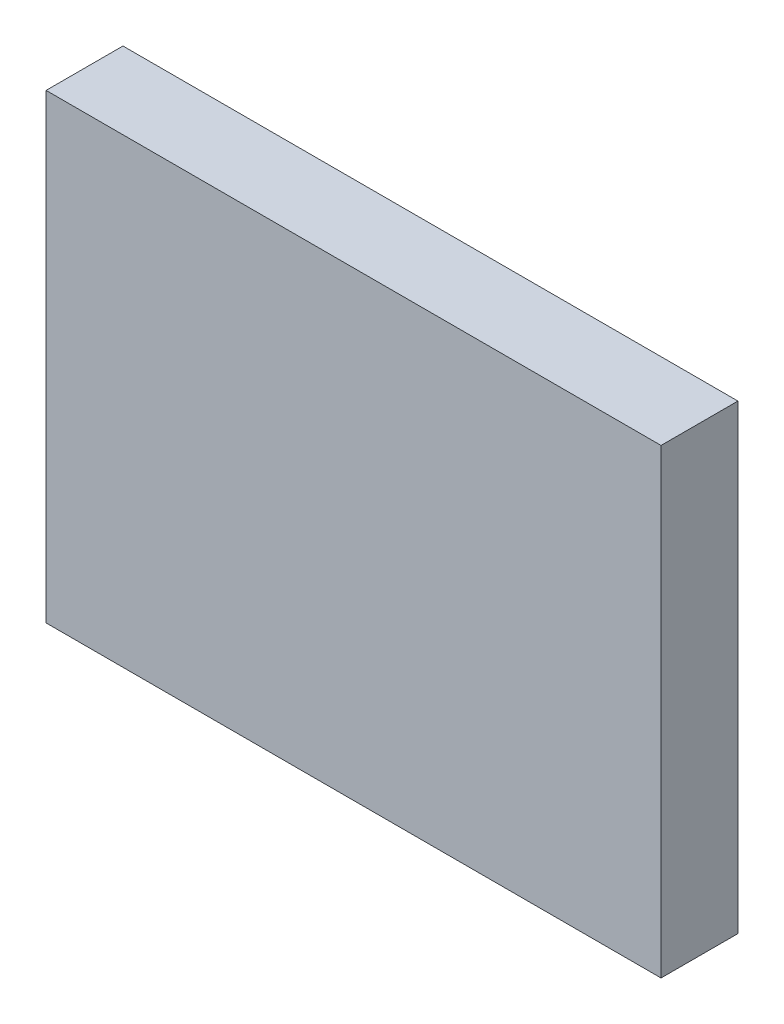
ISO-10303-21;
HEADER;
FILE_DESCRIPTION(('STEP AP214'),'2;1');
FILE_NAME('part.step','',(''),(''),'','','');
FILE_SCHEMA(('AUTOMOTIVE_DESIGN { 1 0 10303 214 1 1 1 1 }'));
ENDSEC;
DATA;
#1=APPLICATION_CONTEXT('core data for automotive mechanical design processes');
#2=APPLICATION_PROTOCOL_DEFINITION('international standard','automotive_design',2000,#1);
#3=PRODUCT_CONTEXT('',#1,'mechanical');
#4=PRODUCT('Part','Part','',(#3));
#5=PRODUCT_RELATED_PRODUCT_CATEGORY('part','',(#4));
#6=PRODUCT_DEFINITION_FORMATION('','',#4);
#7=PRODUCT_DEFINITION_CONTEXT('part definition',#1,'design');
#8=PRODUCT_DEFINITION('design','',#6,#7);
#9=PRODUCT_DEFINITION_SHAPE('','',#8);
#10=(LENGTH_UNIT() NAMED_UNIT(*) SI_UNIT(.MILLI.,.METRE.));
#11=(NAMED_UNIT(*) PLANE_ANGLE_UNIT() SI_UNIT($,.RADIAN.));
#12=(NAMED_UNIT(*) SI_UNIT($,.STERADIAN.) SOLID_ANGLE_UNIT());
#13=UNCERTAINTY_MEASURE_WITH_UNIT(LENGTH_MEASURE(1.E-05),#10,'distance_accuracy_value','');
#14=(GEOMETRIC_REPRESENTATION_CONTEXT(3) GLOBAL_UNCERTAINTY_ASSIGNED_CONTEXT((#13)) GLOBAL_UNIT_ASSIGNED_CONTEXT((#10,
#11,#12)) REPRESENTATION_CONTEXT('',''));
#15=CARTESIAN_POINT('',(0.,0.,0.));
#16=DIRECTION('',(0.,0.,1.));
#17=DIRECTION('',(1.,0.,0.));
#18=AXIS2_PLACEMENT_3D('',#15,#16,#17);
#19=CARTESIAN_POINT('',(0.,0.,10.));
#20=DIRECTION('',(1.,0.,0.));
#21=DIRECTION('',(0.,1.,0.));
#22=AXIS2_PLACEMENT_3D('',#19,#20,#21);
#23=PLANE('',#22);
#24=DIRECTION('',(0.,-1.,0.));
#25=VECTOR('',#24,1.);
#26=CARTESIAN_POINT('',(0.,0.,0.));
#27=LINE('',#26,#25);
#28=CARTESIAN_POINT('',(0.,0.,0.));
#29=VERTEX_POINT('',#28);
#30=CARTESIAN_POINT('',(0.,-60.,0.));
#31=VERTEX_POINT('',#30);
#32=EDGE_CURVE('E102',#29,#31,#27,.T.);
#33=ORIENTED_EDGE('',*,*,#32,.T.);
#34=DIRECTION('',(0.,0.,-1.));
#35=VECTOR('',#34,1.);
#36=CARTESIAN_POINT('',(0.,-60.,10.));
#37=LINE('',#36,#35);
#38=CARTESIAN_POINT('',(0.,-60.,10.));
#39=VERTEX_POINT('',#38);
#40=EDGE_CURVE('E11',#39,#31,#37,.T.);
#41=ORIENTED_EDGE('',*,*,#40,.F.);
#42=DIRECTION('',(0.,-1.,0.));
#43=VECTOR('',#42,1.);
#44=CARTESIAN_POINT('',(0.,0.,10.));
#45=LINE('',#44,#43);
#46=CARTESIAN_POINT('',(0.,0.,10.));
#47=VERTEX_POINT('',#46);
#48=EDGE_CURVE('E90',#47,#39,#45,.T.);
#49=ORIENTED_EDGE('',*,*,#48,.F.);
#50=DIRECTION('',(0.,0.,-1.));
#51=VECTOR('',#50,1.);
#52=CARTESIAN_POINT('',(0.,0.,10.));
#53=LINE('',#52,#51);
#54=EDGE_CURVE('E98',#47,#29,#53,.T.);
#55=ORIENTED_EDGE('',*,*,#54,.T.);
#56=EDGE_LOOP('',(#33,#41,#49,#55));
#57=FACE_BOUND('',#56,.T.);
#58=ADVANCED_FACE('F39',(#57),#23,.F.);
#59=CARTESIAN_POINT('',(0.,-60.,10.));
#60=DIRECTION('',(0.,1.,0.));
#61=DIRECTION('',(0.,0.,1.));
#62=AXIS2_PLACEMENT_3D('',#59,#60,#61);
#63=PLANE('',#62);
#64=DIRECTION('',(1.,0.,0.));
#65=VECTOR('',#64,1.);
#66=CARTESIAN_POINT('',(0.,-60.,0.));
#67=LINE('',#66,#65);
#68=CARTESIAN_POINT('',(80.,-60.,0.));
#69=VERTEX_POINT('',#68);
#70=EDGE_CURVE('E94',#31,#69,#67,.T.);
#71=ORIENTED_EDGE('',*,*,#70,.T.);
#72=DIRECTION('',(0.,0.,-1.));
#73=VECTOR('',#72,1.);
#74=CARTESIAN_POINT('',(80.,-60.,10.));
#75=LINE('',#74,#73);
#76=CARTESIAN_POINT('',(80.,-60.,10.));
#77=VERTEX_POINT('',#76);
#78=EDGE_CURVE('E47',#77,#69,#75,.T.);
#79=ORIENTED_EDGE('',*,*,#78,.F.);
#80=DIRECTION('',(1.,0.,0.));
#81=VECTOR('',#80,1.);
#82=CARTESIAN_POINT('',(0.,-60.,10.));
#83=LINE('',#82,#81);
#84=EDGE_CURVE('E85',#39,#77,#83,.T.);
#85=ORIENTED_EDGE('',*,*,#84,.F.);
#86=ORIENTED_EDGE('',*,*,#40,.T.);
#87=EDGE_LOOP('',(#71,#79,#85,#86));
#88=FACE_BOUND('',#87,.T.);
#89=ADVANCED_FACE('F93',(#88),#63,.F.);
#90=CARTESIAN_POINT('',(80.,0.,10.));
#91=DIRECTION('',(-1.,0.,0.));
#92=DIRECTION('',(0.,-1.,0.));
#93=AXIS2_PLACEMENT_3D('',#90,#91,#92);
#94=PLANE('',#93);
#95=DIRECTION('',(0.,1.,0.));
#96=VECTOR('',#95,1.);
#97=CARTESIAN_POINT('',(80.,0.,0.));
#98=LINE('',#97,#96);
#99=CARTESIAN_POINT('',(80.,0.,0.));
#100=VERTEX_POINT('',#99);
#101=EDGE_CURVE('E72',#69,#100,#98,.T.);
#102=ORIENTED_EDGE('',*,*,#101,.T.);
#103=DIRECTION('',(0.,0.,-1.));
#104=VECTOR('',#103,1.);
#105=CARTESIAN_POINT('',(80.,0.,10.));
#106=LINE('',#105,#104);
#107=CARTESIAN_POINT('',(80.,0.,10.));
#108=VERTEX_POINT('',#107);
#109=EDGE_CURVE('E95',#108,#100,#106,.T.);
#110=ORIENTED_EDGE('',*,*,#109,.F.);
#111=DIRECTION('',(0.,1.,0.));
#112=VECTOR('',#111,1.);
#113=CARTESIAN_POINT('',(80.,0.,10.));
#114=LINE('',#113,#112);
#115=EDGE_CURVE('E88',#77,#108,#114,.T.);
#116=ORIENTED_EDGE('',*,*,#115,.F.);
#117=ORIENTED_EDGE('',*,*,#78,.T.);
#118=EDGE_LOOP('',(#102,#110,#116,#117));
#119=FACE_BOUND('',#118,.T.);
#120=ADVANCED_FACE('F96',(#119),#94,.F.);
#121=CARTESIAN_POINT('',(0.,0.,10.));
#122=DIRECTION('',(0.,-1.,0.));
#123=DIRECTION('',(0.,0.,-1.));
#124=AXIS2_PLACEMENT_3D('',#121,#122,#123);
#125=PLANE('',#124);
#126=DIRECTION('',(-1.,0.,0.));
#127=VECTOR('',#126,1.);
#128=CARTESIAN_POINT('',(0.,0.,0.));
#129=LINE('',#128,#127);
#130=EDGE_CURVE('E78',#100,#29,#129,.T.);
#131=ORIENTED_EDGE('',*,*,#130,.T.);
#132=ORIENTED_EDGE('',*,*,#54,.F.);
#133=DIRECTION('',(-1.,0.,0.));
#134=VECTOR('',#133,1.);
#135=CARTESIAN_POINT('',(0.,0.,10.));
#136=LINE('',#135,#134);
#137=EDGE_CURVE('E55',#108,#47,#136,.T.);
#138=ORIENTED_EDGE('',*,*,#137,.F.);
#139=ORIENTED_EDGE('',*,*,#109,.T.);
#140=EDGE_LOOP('',(#131,#132,#138,#139));
#141=FACE_BOUND('',#140,.T.);
#142=ADVANCED_FACE('F109',(#141),#125,.F.);
#143=CARTESIAN_POINT('',(0.,0.,10.));
#144=DIRECTION('',(0.,0.,1.));
#145=DIRECTION('',(1.,0.,0.));
#146=AXIS2_PLACEMENT_3D('',#143,#144,#145);
#147=PLANE('',#146);
#148=ORIENTED_EDGE('',*,*,#48,.T.);
#149=ORIENTED_EDGE('',*,*,#84,.T.);
#150=ORIENTED_EDGE('',*,*,#115,.T.);
#151=ORIENTED_EDGE('',*,*,#137,.T.);
#152=EDGE_LOOP('',(#148,#149,#150,#151));
#153=FACE_BOUND('',#152,.T.);
#154=ADVANCED_FACE('F86',(#153),#147,.T.);
#155=CARTESIAN_POINT('',(0.,0.,0.));
#156=DIRECTION('',(0.,0.,1.));
#157=DIRECTION('',(1.,0.,0.));
#158=AXIS2_PLACEMENT_3D('',#155,#156,#157);
#159=PLANE('',#158);
#160=ORIENTED_EDGE('',*,*,#32,.F.);
#161=ORIENTED_EDGE('',*,*,#130,.F.);
#162=ORIENTED_EDGE('',*,*,#101,.F.);
#163=ORIENTED_EDGE('',*,*,#70,.F.);
#164=EDGE_LOOP('',(#160,#161,#162,#163));
#165=FACE_BOUND('',#164,.T.);
#166=ADVANCED_FACE('F112',(#165),#159,.F.);
#167=CLOSED_SHELL('',(#58,#89,#120,#142,#154,#166));
#168=MANIFOLD_SOLID_BREP('B2',#167);
#169=ADVANCED_BREP_SHAPE_REPRESENTATION('',(#18,#168),#14);
#170=SHAPE_DEFINITION_REPRESENTATION(#9,#169);
ENDSEC;
END-ISO-10303-21;
